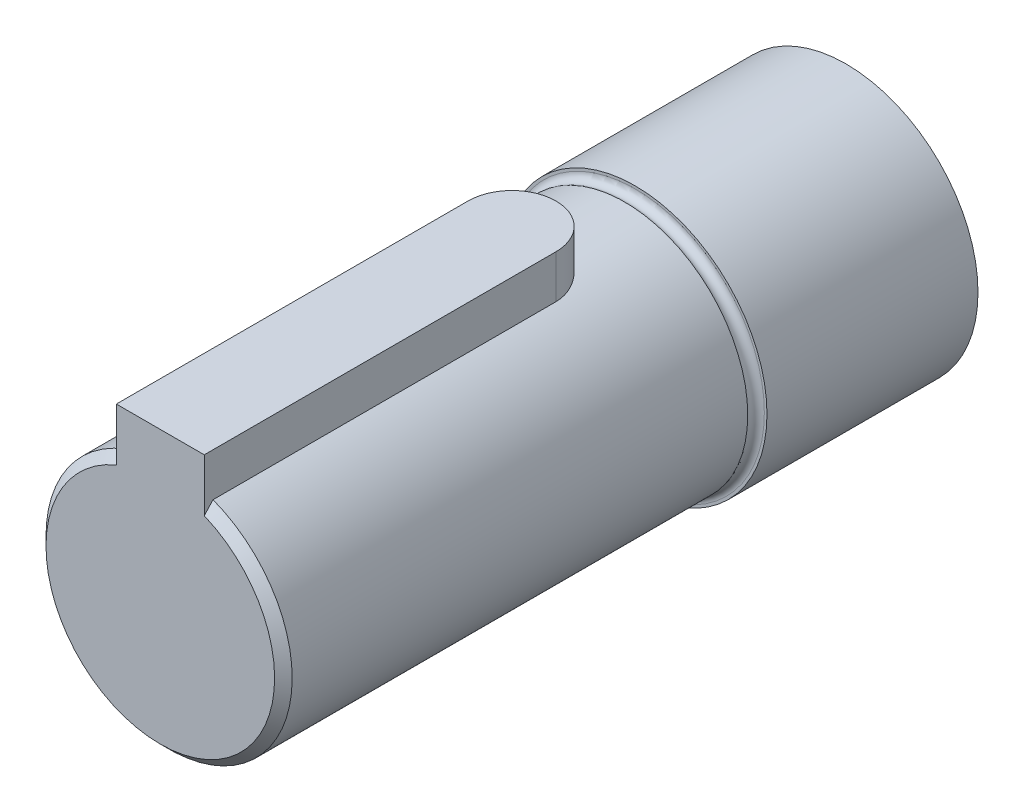
ISO-10303-21;
HEADER;
FILE_DESCRIPTION(('STEP AP214'),'2;1');
FILE_NAME('part.step','',(''),(''),'','','');
FILE_SCHEMA(('AUTOMOTIVE_DESIGN { 1 0 10303 214 1 1 1 1 }'));
ENDSEC;
DATA;
#1=APPLICATION_CONTEXT('core data for automotive mechanical design processes');
#2=APPLICATION_PROTOCOL_DEFINITION('international standard','automotive_design',2000,#1);
#3=PRODUCT_CONTEXT('',#1,'mechanical');
#4=PRODUCT('Part','Part','',(#3));
#5=PRODUCT_RELATED_PRODUCT_CATEGORY('part','',(#4));
#6=PRODUCT_DEFINITION_FORMATION('','',#4);
#7=PRODUCT_DEFINITION_CONTEXT('part definition',#1,'design');
#8=PRODUCT_DEFINITION('design','',#6,#7);
#9=PRODUCT_DEFINITION_SHAPE('','',#8);
#10=(LENGTH_UNIT() NAMED_UNIT(*) SI_UNIT(.MILLI.,.METRE.));
#11=(NAMED_UNIT(*) PLANE_ANGLE_UNIT() SI_UNIT($,.RADIAN.));
#12=(NAMED_UNIT(*) SI_UNIT($,.STERADIAN.) SOLID_ANGLE_UNIT());
#13=UNCERTAINTY_MEASURE_WITH_UNIT(LENGTH_MEASURE(1.E-05),#10,'distance_accuracy_value','');
#14=(GEOMETRIC_REPRESENTATION_CONTEXT(3) GLOBAL_UNCERTAINTY_ASSIGNED_CONTEXT((#13)) GLOBAL_UNIT_ASSIGNED_CONTEXT((#10,
#11,#12)) REPRESENTATION_CONTEXT('',''));
#15=CARTESIAN_POINT('',(0.,0.,0.));
#16=DIRECTION('',(0.,0.,1.));
#17=DIRECTION('',(1.,0.,0.));
#18=AXIS2_PLACEMENT_3D('',#15,#16,#17);
#19=CARTESIAN_POINT('',(0.,0.,29.4999999873967));
#20=DIRECTION('',(0.,0.,-1.));
#21=DIRECTION('',(-5.78142039967742E-10,-1.,0.));
#22=AXIS2_PLACEMENT_3D('',#19,#20,#21);
#23=CONICAL_SURFACE('',#22,7.0000000126033,0.785398163397454);
#24=CARTESIAN_POINT('',(-2.5,6.53834842880419,29.4999999873967));
#25=CARTESIAN_POINT('',(-2.5,6.3596151819461,29.6669457342591));
#26=CARTESIAN_POINT('',(-2.5,6.17964192467686,29.8341766803335));
#27=CARTESIAN_POINT('',(-2.5,5.99999998178189,30.0000000084084));
#28=B_SPLINE_CURVE_WITH_KNOTS('',3,(#24,#25,#26,#27),.UNSPECIFIED.,.F.,.F.,(4,4),(0.,1.),.UNSPECIFIED.);
#29=CARTESIAN_POINT('',(-2.5,6.53834842880419,29.4999999873967));
#30=VERTEX_POINT('',#29);
#31=CARTESIAN_POINT('',(-2.50000000646797,5.99999999730502,30.));
#32=VERTEX_POINT('',#31);
#33=EDGE_CURVE('E76',#30,#32,#28,.T.);
#34=ORIENTED_EDGE('',*,*,#33,.F.);
#35=CARTESIAN_POINT('',(0.,0.,29.4999999873967));
#36=DIRECTION('',(0.,0.,1.));
#37=DIRECTION('',(-0.357142856499832,0.934049773861726,0.));
#38=AXIS2_PLACEMENT_3D('',#35,#36,#37);
#39=CIRCLE('',#38,7.0000000126033);
#40=CARTESIAN_POINT('',(2.49999999999992,6.53834841531104,29.5));
#41=VERTEX_POINT('',#40);
#42=EDGE_CURVE('E64',#41,#30,#39,.F.);
#43=ORIENTED_EDGE('',*,*,#42,.F.);
#44=CARTESIAN_POINT('',(2.5,6.00000000000012,30.));
#45=CARTESIAN_POINT('',(2.5,6.17968129069737,29.83414034705));
#46=CARTESIAN_POINT('',(2.5,6.35965928277175,29.666904543798));
#47=CARTESIAN_POINT('',(2.5,6.53834841531104,29.5));
#48=B_SPLINE_CURVE_WITH_KNOTS('',3,(#44,#45,#46,#47),.UNSPECIFIED.,.F.,.F.,(4,4),(0.,1.),.UNSPECIFIED.);
#49=CARTESIAN_POINT('',(2.49999999999991,6.00000000000004,30.));
#50=VERTEX_POINT('',#49);
#51=EDGE_CURVE('E75',#50,#41,#48,.T.);
#52=ORIENTED_EDGE('',*,*,#51,.F.);
#53=CARTESIAN_POINT('',(0.,0.,30.));
#54=DIRECTION('',(0.,0.,-1.));
#55=DIRECTION('',(0.384615384615371,0.923076923076929,0.));
#56=AXIS2_PLACEMENT_3D('',#53,#54,#55);
#57=CIRCLE('',#56,6.5);
#58=EDGE_CURVE('E91',#50,#32,#57,.T.);
#59=ORIENTED_EDGE('',*,*,#58,.T.);
#60=EDGE_LOOP('',(#34,#43,#52,#59));
#61=FACE_BOUND('',#60,.T.);
#62=ADVANCED_FACE('F17',(#61),#23,.T.);
#63=CARTESIAN_POINT('',(6.67710892902475,-6.50000000066228,30.));
#64=DIRECTION('',(0.,0.,1.));
#65=DIRECTION('',(0.,1.,0.));
#66=AXIS2_PLACEMENT_3D('',#63,#64,#65);
#67=PLANE('',#66);
#68=ORIENTED_EDGE('',*,*,#58,.F.);
#69=DIRECTION('',(0.,1.,0.));
#70=VECTOR('',#69,1.);
#71=CARTESIAN_POINT('',(2.49999999999994,6.00000000000011,30.));
#72=LINE('',#71,#70);
#73=CARTESIAN_POINT('',(2.5,9.,30.));
#74=VERTEX_POINT('',#73);
#75=EDGE_CURVE('E119',#74,#50,#72,.F.);
#76=ORIENTED_EDGE('',*,*,#75,.F.);
#77=DIRECTION('',(-1.,0.,0.));
#78=VECTOR('',#77,1.);
#79=CARTESIAN_POINT('',(2.5,9.,30.));
#80=LINE('',#79,#78);
#81=CARTESIAN_POINT('',(-2.5,9.,30.));
#82=VERTEX_POINT('',#81);
#83=EDGE_CURVE('E123',#82,#74,#80,.F.);
#84=ORIENTED_EDGE('',*,*,#83,.F.);
#85=DIRECTION('',(0.,-1.,0.));
#86=VECTOR('',#85,1.);
#87=CARTESIAN_POINT('',(-2.5,9.,30.));
#88=LINE('',#87,#86);
#89=EDGE_CURVE('E127',#82,#32,#88,.T.);
#90=ORIENTED_EDGE('',*,*,#89,.T.);
#91=EDGE_LOOP('',(#68,#76,#84,#90));
#92=FACE_BOUND('',#91,.T.);
#93=ADVANCED_FACE('F105',(#92),#67,.T.);
#94=CARTESIAN_POINT('',(7.5,-7.70492968244106,3.));
#95=DIRECTION('',(0.,0.,1.));
#96=DIRECTION('',(0.,1.,0.));
#97=AXIS2_PLACEMENT_3D('',#94,#95,#96);
#98=PLANE('',#97);
#99=CARTESIAN_POINT('',(0.,0.,3.));
#100=DIRECTION('',(0.,0.,1.));
#101=DIRECTION('',(-1.,0.,0.));
#102=AXIS2_PLACEMENT_3D('',#99,#100,#101);
#103=CIRCLE('',#102,7.5);
#104=CARTESIAN_POINT('',(-7.5,0.,3.));
#105=VERTEX_POINT('',#104);
#106=EDGE_CURVE('E131',#105,#105,#103,.F.);
#107=ORIENTED_EDGE('',*,*,#106,.F.);
#108=EDGE_LOOP('',(#107));
#109=FACE_BOUND('',#108,.T.);
#110=CARTESIAN_POINT('',(0.,0.,3.));
#111=DIRECTION('',(0.,0.,-1.));
#112=DIRECTION('',(1.,-1.16855773734685E-09,0.));
#113=AXIS2_PLACEMENT_3D('',#110,#111,#112);
#114=CIRCLE('',#113,7.35);
#115=CARTESIAN_POINT('',(7.35,-8.58889936949936E-09,3.));
#116=VERTEX_POINT('',#115);
#117=EDGE_CURVE('E136',#116,#116,#114,.T.);
#118=ORIENTED_EDGE('',*,*,#117,.T.);
#119=EDGE_LOOP('',(#118));
#120=FACE_BOUND('',#119,.T.);
#121=ADVANCED_FACE('F229',(#109,#120),#98,.T.);
#122=CARTESIAN_POINT('',(-7.5,-7.70492968244106,-9.));
#123=DIRECTION('',(0.,0.,-1.));
#124=DIRECTION('',(0.,1.,0.));
#125=AXIS2_PLACEMENT_3D('',#122,#123,#124);
#126=PLANE('',#125);
#127=CARTESIAN_POINT('',(0.,0.,-9.));
#128=DIRECTION('',(0.,0.,-1.));
#129=DIRECTION('',(1.,0.,0.));
#130=AXIS2_PLACEMENT_3D('',#127,#128,#129);
#131=CIRCLE('',#130,7.5);
#132=CARTESIAN_POINT('',(7.5,0.,-9.));
#133=VERTEX_POINT('',#132);
#134=EDGE_CURVE('E139',#133,#133,#131,.T.);
#135=ORIENTED_EDGE('',*,*,#134,.T.);
#136=EDGE_LOOP('',(#135));
#137=FACE_BOUND('',#136,.T.);
#138=ADVANCED_FACE('F165',(#137),#126,.T.);
#139=CARTESIAN_POINT('',(0.,9.,10.));
#140=DIRECTION('',(0.,-1.,0.));
#141=DIRECTION('',(-1.,0.,0.));
#142=AXIS2_PLACEMENT_3D('',#139,#140,#141);
#143=CYLINDRICAL_SURFACE('',#142,2.5);
#144=DIRECTION('',(0.,-1.,0.));
#145=VECTOR('',#144,1.);
#146=CARTESIAN_POINT('',(2.5,9.,10.));
#147=LINE('',#146,#145);
#148=CARTESIAN_POINT('',(2.5,9.,10.));
#149=VERTEX_POINT('',#148);
#150=CARTESIAN_POINT('',(2.5,6.53834841531101,10.));
#151=VERTEX_POINT('',#150);
#152=EDGE_CURVE('E142',#149,#151,#147,.T.);
#153=ORIENTED_EDGE('',*,*,#152,.T.);
#154=CARTESIAN_POINT('',(2.5,6.53834841531101,10.));
#155=CARTESIAN_POINT('',(2.50000033042518,6.53834835698629,9.97131201048583));
#156=CARTESIAN_POINT('',(2.49950621211561,6.53854388529524,9.94262418556709));
#157=CARTESIAN_POINT('',(2.49753208366229,6.53931678359144,9.88530527254322));
#158=CARTESIAN_POINT('',(2.4960526800563,6.5398939186615,9.85667416039481));
#159=CARTESIAN_POINT('',(2.49211182631204,6.54142039381196,9.7995019639747));
#160=CARTESIAN_POINT('',(2.48965079776213,6.54236957410332,9.77096084634914));
#161=CARTESIAN_POINT('',(2.48375208937392,6.54463042552794,9.7140015605609));
#162=CARTESIAN_POINT('',(2.48031465935056,6.54594200393833,9.68558336283451));
#163=CARTESIAN_POINT('',(2.47246945648134,6.5489179656356,9.62890259502733));
#164=CARTESIAN_POINT('',(2.46806177558035,6.55058231549188,9.60064001045996));
#165=CARTESIAN_POINT('',(2.45828344785599,6.55425414698561,9.54430283383157));
#166=CARTESIAN_POINT('',(2.45291274919943,6.55626164709242,9.51622825197398));
#167=CARTESIAN_POINT('',(2.44121677033656,6.56061007245973,9.46029910743583));
#168=CARTESIAN_POINT('',(2.43489130870004,6.56295106108709,9.43244458763384));
#169=CARTESIAN_POINT('',(2.4212952043084,6.56795692200546,9.37698724927819));
#170=CARTESIAN_POINT('',(2.41402426464626,6.57062189601991,9.34938451271784));
#171=CARTESIAN_POINT('',(2.39854756331674,6.57626560037649,9.29446195584115));
#172=CARTESIAN_POINT('',(2.39034140317694,6.5792444644177,9.26714226157048));
#173=CARTESIAN_POINT('',(2.37301191436803,6.58550579889605,9.21283630033987));
#174=CARTESIAN_POINT('',(2.36388875706963,6.58878821259595,9.18584997213426));
#175=CARTESIAN_POINT('',(2.34477171500307,6.59561618136473,9.13233060563941));
#176=CARTESIAN_POINT('',(2.3347810273409,6.59916076365589,9.10579630077277));
#177=CARTESIAN_POINT('',(2.31395339151458,6.60649242392418,9.0532071448911));
#178=CARTESIAN_POINT('',(2.30311958539224,6.61027859289546,9.02715092243918));
#179=CARTESIAN_POINT('',(2.28062488013071,6.61807292191684,8.97552920274319));
#180=CARTESIAN_POINT('',(2.26896663515193,6.62208036123592,8.94996243979018));
#181=CARTESIAN_POINT('',(2.24484099774433,6.63029711374625,8.89933054655143));
#182=CARTESIAN_POINT('',(2.23237580495135,6.6345058706108,8.87426427763958));
#183=CARTESIAN_POINT('',(2.20665302576841,6.64310506670627,8.82464401542963));
#184=CARTESIAN_POINT('',(2.19339721585091,6.64749509227387,8.80008902934751));
#185=CARTESIAN_POINT('',(2.16610881128199,6.65643668218123,8.75150185416327));
#186=CARTESIAN_POINT('',(2.15207759916206,6.66098795413039,8.72746883463431));
#187=CARTESIAN_POINT('',(2.12325290447927,6.67023190759674,8.67993611678249));
#188=CARTESIAN_POINT('',(2.10846043754749,6.67492439740436,8.65643576518804));
#189=CARTESIAN_POINT('',(2.07812671008393,6.68443067975972,8.60997903294129));
#190=CARTESIAN_POINT('',(2.062586123146,6.68924436139204,8.58702218971792));
#191=CARTESIAN_POINT('',(2.03076865776043,6.698972939867,8.5416633660243));
#192=CARTESIAN_POINT('',(2.01449213361217,6.70388778739779,8.51926112642548));
#193=CARTESIAN_POINT('',(1.98121438944342,6.71379862931522,8.47502275563933));
#194=CARTESIAN_POINT('',(1.96421322515208,6.71879461744346,8.45318658112518));
#195=CARTESIAN_POINT('',(1.92949696360667,6.72884769068264,8.41009204679963));
#196=CARTESIAN_POINT('',(1.91178164235991,6.73390479460858,8.38883387183179));
#197=CARTESIAN_POINT('',(1.87564707604988,6.7440600670457,8.34690760541846));
#198=CARTESIAN_POINT('',(1.85722734442384,6.74915826194899,8.32623993972713));
#199=CARTESIAN_POINT('',(1.81969329728039,6.75937570269088,8.28550762051644));
#200=CARTESIAN_POINT('',(1.80057824829812,6.76449496539127,8.26544364710577));
#201=CARTESIAN_POINT('',(1.76166232578217,6.7747345398304,8.22593239270263));
#202=CARTESIAN_POINT('',(1.74186048630797,6.77985484206937,8.20648606062149));
#203=CARTESIAN_POINT('',(1.70157925982381,6.79007652988798,8.16822461059497));
#204=CARTESIAN_POINT('',(1.68109868786178,6.79517786299387,8.14941072609088));
#205=CARTESIAN_POINT('',(1.63946787843663,6.80534159035887,8.11242960869761));
#206=CARTESIAN_POINT('',(1.61831624978087,6.81040387244938,8.09426391100499));
#207=CARTESIAN_POINT('',(1.57535096763223,6.82046976538484,8.05859563019431));
#208=CARTESIAN_POINT('',(1.55353572925055,6.82547318844472,8.04109490305109));
#209=CARTESIAN_POINT('',(1.50925055820123,6.83540062338372,8.00677400545535));
#210=CARTESIAN_POINT('',(1.48677885901029,6.84032435225382,7.98995603234644));
#211=CARTESIAN_POINT('',(1.4411888543316,6.85007545470666,7.9570197783906));
#212=CARTESIAN_POINT('',(1.41806862220891,6.85490244692599,7.94090405107409));
#213=CARTESIAN_POINT('',(1.37142209661549,6.86438107311626,7.90954879761937));
#214=CARTESIAN_POINT('',(1.34789924957612,6.86903361541724,7.89430441949106));
#215=CARTESIAN_POINT('',(1.30067120207562,6.87810666463014,7.86481421880659));
#216=CARTESIAN_POINT('',(1.27697343132574,6.88252953962224,7.85055722642518));
#217=CARTESIAN_POINT('',(1.22941926862106,6.89114294154318,7.82301286257404));
#218=CARTESIAN_POINT('',(1.20556940745461,6.89533580901046,7.80971494819165));
#219=CARTESIAN_POINT('',(1.15773091271954,6.90348587947971,7.78406084967827));
#220=CARTESIAN_POINT('',(1.13374797989234,6.90744541491633,7.77169477659059));
#221=CARTESIAN_POINT('',(1.08566009690976,6.91512632113813,7.74787802348169));
#222=CARTESIAN_POINT('',(1.06156007673648,6.91884998223303,7.73641812862188));
#223=CARTESIAN_POINT('',(1.01325180679041,6.92605645545394,7.71438900483803));
#224=CARTESIAN_POINT('',(0.989047775156104,6.92954149382183,7.7038112547758));
#225=CARTESIAN_POINT('',(0.940542594725864,6.9362681168356,7.68352345513097));
#226=CARTESIAN_POINT('',(0.9162450089029,6.93951183784532,7.67380559603577));
#227=CARTESIAN_POINT('',(0.867561397392513,6.9457532324043,7.65521648011593));
#228=CARTESIAN_POINT('',(0.843178334856701,6.9487529270443,7.6463381423385));
#229=CARTESIAN_POINT('',(0.794330257617022,6.95450370456068,7.62940893710983));
#230=CARTESIAN_POINT('',(0.769867660486815,6.95725666762405,7.62135173336299));
#231=CARTESIAN_POINT('',(0.720865048376648,6.96251144222546,7.60604771480116));
#232=CARTESIAN_POINT('',(0.696326958930161,6.96501496777727,7.59879532380714));
#233=CARTESIAN_POINT('',(0.647176174448744,6.96976835292572,7.58508597359225));
#234=CARTESIAN_POINT('',(0.622564966079988,6.97201973578177,7.57862421324201));
#235=CARTESIAN_POINT('',(0.573269259916866,6.97626634524044,7.56648335514011));
#236=CARTESIAN_POINT('',(0.548585863056041,6.97826288086937,7.5608002457773));
#237=CARTESIAN_POINT('',(0.499145821531022,6.98199732852479,7.55020616362175));
#238=CARTESIAN_POINT('',(0.474389945456518,6.98373631337065,7.54529198275029));
#239=CARTESIAN_POINT('',(0.424803930445104,6.9869532133611,7.53622752221305));
#240=CARTESIAN_POINT('',(0.399974281651311,6.98843194504885,7.53207485152814));
#241=CARTESIAN_POINT('',(0.350238864488794,6.99112591181195,7.52452750736371));
#242=CARTESIAN_POINT('',(0.325333362433822,6.99234168936851,7.5211312728967));
#243=CARTESIAN_POINT('',(0.275443753480164,6.99450733770792,7.51509326304633));
#244=CARTESIAN_POINT('',(0.250459744569892,6.99545746175385,7.51245076902914));
#245=CARTESIAN_POINT('',(0.200410220199073,6.99708940689542,7.5079190966246));
#246=CARTESIAN_POINT('',(0.175344690915676,6.99777117980965,7.50603005351566));
#247=CARTESIAN_POINT('',(0.125129019775239,6.99886403745214,7.50300655748976));
#248=CARTESIAN_POINT('',(0.0999788098913837,6.99927476350071,7.50187310443445));
#249=CARTESIAN_POINT('',(0.0495906803332372,6.99982314985702,7.50036449910905));
#250=CARTESIAN_POINT('',(0.0243526971779215,6.99996013528159,7.49999122093946));
#251=CARTESIAN_POINT('',(-0.0262138522016395,6.99995866710894,7.50000912462505));
#252=CARTESIAN_POINT('',(-0.0515424174454474,6.99981922017041,7.50040306333379));
#253=CARTESIAN_POINT('',(-0.102292562202566,6.99926251479028,7.5019640156345));
#254=CARTESIAN_POINT('',(-0.12771401518503,6.99884394576933,7.5031346760854));
#255=CARTESIAN_POINT('',(-0.178651702410754,6.99772662106783,7.50626014325843));
#256=CARTESIAN_POINT('',(-0.204167622308781,6.99702624221045,7.50821949272161));
#257=CARTESIAN_POINT('',(-0.255295119076429,6.99534291665223,7.51293586009119));
#258=CARTESIAN_POINT('',(-0.280906130340833,6.99435804210822,7.51569832101481));
#259=CARTESIAN_POINT('',(-0.332223561327009,6.9921033346395,7.5220368710743));
#260=CARTESIAN_POINT('',(-0.357929099534993,6.99083128022607,7.52561930631113));
#261=CARTESIAN_POINT('',(-0.409433972067051,6.98799981053896,7.53361618081237));
#262=CARTESIAN_POINT('',(-0.43523204307352,6.98643789398421,7.53803787037782));
#263=CARTESIAN_POINT('',(-0.486918757688592,6.98302428136453,7.54773401420638));
#264=CARTESIAN_POINT('',(-0.512805688958429,6.981169820582,7.55301662228196));
#265=CARTESIAN_POINT('',(-0.564665034703364,6.97716868807356,7.56445770699753));
#266=CARTESIAN_POINT('',(-0.590635219181745,6.97501900677617,7.57062523834353));
#267=CARTESIAN_POINT('',(-0.642653849208492,6.97042496516034,7.58386156109214));
#268=CARTESIAN_POINT('',(-0.668699476868664,6.96797737053913,7.59094030337774));
#269=CARTESIAN_POINT('',(-0.72085937464593,6.96278507890305,7.6060266631998));
#270=CARTESIAN_POINT('',(-0.746970167132886,6.9600369454072,7.61404512086595));
#271=CARTESIAN_POINT('',(-0.79924805851622,6.95424088058603,7.63104064844712));
#272=CARTESIAN_POINT('',(-0.825410945749709,6.95118932996726,7.64002943807992));
#273=CARTESIAN_POINT('',(-0.877777822895495,6.94478466403061,7.65899745177019));
#274=CARTESIAN_POINT('',(-0.903976792687801,6.94142778363727,7.66898926363771));
#275=CARTESIAN_POINT('',(-0.956364489907798,6.93441138135515,7.68998385954125));
#276=CARTESIAN_POINT('',(-0.982547784185236,6.93074823747895,7.70099898940229));
#277=CARTESIAN_POINT('',(-1.03444339163169,6.92319715664518,7.72387843300328));
#278=CARTESIAN_POINT('',(-1.06015654923103,6.91930968864247,7.73574098672264));
#279=CARTESIAN_POINT('',(-1.11096400652725,6.91134689611999,7.76023463838376));
#280=CARTESIAN_POINT('',(-1.13606133339048,6.90727303587794,7.77285993428929));
#281=CARTESIAN_POINT('',(-1.185633199421,6.89895535111201,7.79885207508242));
#282=CARTESIAN_POINT('',(-1.21011067770648,6.89471276751009,7.81221371270706));
#283=CARTESIAN_POINT('',(-1.2584396252469,6.88607586017046,7.83965342037805));
#284=CARTESIAN_POINT('',(-1.2822939192903,6.88168256949183,7.85372684121363));
#285=CARTESIAN_POINT('',(-1.3293737492374,6.87276236118911,7.88256678859471));
#286=CARTESIAN_POINT('',(-1.35260197278715,6.86823628739327,7.89732918937071));
#287=CARTESIAN_POINT('',(-1.39842723805307,6.85906863225044,7.92752550786937));
#288=CARTESIAN_POINT('',(-1.42102680994452,6.85442772361998,7.94295579062739));
#289=CARTESIAN_POINT('',(-1.46559251413301,6.84504849310738,7.97446795259535));
#290=CARTESIAN_POINT('',(-1.48756100095085,6.84031069125652,7.99054665713922));
#291=CARTESIAN_POINT('',(-1.53086229760508,6.83075575169014,8.0233373382517));
#292=CARTESIAN_POINT('',(-1.55219726978297,6.82593899980414,8.04004657209347));
#293=CARTESIAN_POINT('',(-1.59422918095447,6.81624421838166,8.07408150529992));
#294=CARTESIAN_POINT('',(-1.61492807481116,6.81136645904778,8.0914048676523));
#295=CARTESIAN_POINT('',(-1.6556852230241,6.80156770230811,8.12665268665319));
#296=CARTESIAN_POINT('',(-1.67574521026723,6.79664687813169,8.14457518784997));
#297=CARTESIAN_POINT('',(-1.71522156454508,6.78678001244196,8.18100726147304));
#298=CARTESIAN_POINT('',(-1.73463942839255,6.78183406593576,8.19951523781869));
#299=CARTESIAN_POINT('',(-1.77282806330787,6.77193495744798,8.2371054955729));
#300=CARTESIAN_POINT('',(-1.79160008103715,6.76698183112709,8.25618651989974));
#301=CARTESIAN_POINT('',(-1.8284929482601,6.75708634588379,8.29491126910303));
#302=CARTESIAN_POINT('',(-1.84661477985318,6.75214398231484,8.31455405715657));
#303=CARTESIAN_POINT('',(-1.88220249160966,6.74228798632072,8.35439179184074));
#304=CARTESIAN_POINT('',(-1.89966907423854,6.73737432818914,8.37458610457773));
#305=CARTESIAN_POINT('',(-1.93394069819012,6.72759368749535,8.41551730627507));
#306=CARTESIAN_POINT('',(-1.95074614631177,6.72272667767027,8.43625384809619));
#307=CARTESIAN_POINT('',(-1.983689011437,6.71305725845671,8.47826077850066));
#308=CARTESIAN_POINT('',(-1.9998265223103,6.70825484005526,8.49953109139006));
#309=CARTESIAN_POINT('',(-2.03142603545337,6.69873250871243,8.54259757678868));
#310=CARTESIAN_POINT('',(-2.04688779993375,6.69401262515932,8.56439393028523));
#311=CARTESIAN_POINT('',(-2.07712727277772,6.68467324836683,8.60850513756579));
#312=CARTESIAN_POINT('',(-2.09190439129352,6.68005384344644,8.63082041444858));
#313=CARTESIAN_POINT('',(-2.1207648776146,6.670933288247,8.67596261840966));
#314=CARTESIAN_POINT('',(-2.13484728128047,6.66643230614545,8.69879019594274));
#315=CARTESIAN_POINT('',(-2.16230742444568,6.65756644001058,8.74495053756064));
#316=CARTESIAN_POINT('',(-2.17568380132375,6.65320182534268,8.76828416410872));
#317=CARTESIAN_POINT('',(-2.20171969210835,6.64462651623491,8.81545039935462));
#318=CARTESIAN_POINT('',(-2.21437741868644,6.64041621406247,8.83928406615386));
#319=CARTESIAN_POINT('',(-2.23896246360707,6.63216733046749,8.88744430490007));
#320=CARTESIAN_POINT('',(-2.25088754162491,6.62812928627256,8.91177211274221));
#321=CARTESIAN_POINT('',(-2.27399234211374,6.62024269729253,8.96091454726184));
#322=CARTESIAN_POINT('',(-2.28516934093589,6.6163948570311,8.98573056784214));
#323=CARTESIAN_POINT('',(-2.30676158381022,6.60890643218974,9.03584319034548));
#324=CARTESIAN_POINT('',(-2.31717358860567,6.60526674194719,9.06114132197275));
#325=CARTESIAN_POINT('',(-2.33721794844976,6.59821235201074,9.11221163071139));
#326=CARTESIAN_POINT('',(-2.34684651453894,6.59479875904948,9.13798544822012));
#327=CARTESIAN_POINT('',(-2.36530456868721,6.58821427296193,9.19000014127277));
#328=CARTESIAN_POINT('',(-2.37412968238799,6.5850447214315,9.21624273941674));
#329=CARTESIAN_POINT('',(-2.39095983964241,6.57896601778042,9.2691873968065));
#330=CARTESIAN_POINT('',(-2.39895988642059,6.57605846439706,9.29589122852343));
#331=CARTESIAN_POINT('',(-2.41411732971881,6.57052138814165,9.34974997757176));
#332=CARTESIAN_POINT('',(-2.42126906904711,6.56789374259328,9.37690668060049));
#333=CARTESIAN_POINT('',(-2.43470571653123,6.56293426781146,9.43166186113885));
#334=CARTESIAN_POINT('',(-2.44098426853711,6.56060461668582,9.45926209632233));
#335=CARTESIAN_POINT('',(-2.45264874234527,6.55625823286967,9.51489386074681));
#336=CARTESIAN_POINT('',(-2.45802757034528,6.55424399429345,9.54292707292447));
#337=CARTESIAN_POINT('',(-2.46785089968016,6.55055340148732,9.59933093736517));
#338=CARTESIAN_POINT('',(-2.47229035679781,6.54887887331518,9.62770258811842));
#339=CARTESIAN_POINT('',(-2.48019074918735,6.54589353088318,9.68459769916326));
#340=CARTESIAN_POINT('',(-2.48365179185423,6.54458267670518,9.71312114244302));
#341=CARTESIAN_POINT('',(-2.48958936713261,6.54232859304191,9.77028194064711));
#342=CARTESIAN_POINT('',(-2.49206599766069,6.54138532699391,9.79891928395581));
#343=CARTESIAN_POINT('',(-2.49603067390584,6.53987200270748,9.85627411069227));
#344=CARTESIAN_POINT('',(-2.49751865392874,6.53930196926977,9.88499159931825));
#345=CARTESIAN_POINT('',(-2.4995036020871,6.53854011962566,9.9424726851217));
#346=CARTESIAN_POINT('',(-2.50000033289154,6.53834839399617,9.97123629169161));
#347=CARTESIAN_POINT('',(-2.5,6.53834841531101,10.));
#348=B_SPLINE_CURVE_WITH_KNOTS('',3,(#154,#155,#156,#157,#158,#159,#160,#161,#162,#163,#164,
#165,#166,#167,#168,#169,#170,#171,#172,#173,#174,#175,#176,#177,#178,#179,#180,#181,#182,#183,
#184,#185,#186,#187,#188,#189,#190,#191,#192,#193,#194,#195,#196,#197,#198,#199,#200,#201,#202,
#203,#204,#205,#206,#207,#208,#209,#210,#211,#212,#213,#214,#215,#216,#217,#218,#219,#220,#221,
#222,#223,#224,#225,#226,#227,#228,#229,#230,#231,#232,#233,#234,#235,#236,#237,#238,#239,#240,
#241,#242,#243,#244,#245,#246,#247,#248,#249,#250,#251,#252,#253,#254,#255,#256,#257,#258,#259,
#260,#261,#262,#263,#264,#265,#266,#267,#268,#269,#270,#271,#272,#273,#274,#275,#276,#277,#278,
#279,#280,#281,#282,#283,#284,#285,#286,#287,#288,#289,#290,#291,#292,#293,#294,#295,#296,#297,
#298,#299,#300,#301,#302,#303,#304,#305,#306,#307,#308,#309,#310,#311,#312,#313,#314,#315,#316,
#317,#318,#319,#320,#321,#322,#323,#324,#325,#326,#327,#328,#329,#330,#331,#332,#333,#334,#335,
#336,#337,#338,#339,#340,#341,#342,#343,#344,#345,#346,#347),.UNSPECIFIED.,.F.,.F.,(4,2,2,2,2,2,
2,2,2,2,2,2,2,2,2,2,2,2,2,2,2,2,2,2,2,2,2,2,2,2,2,2,2,2,2,2,2,2,2,2,2,2,2,2,2,2,2,2,2,2,2,2,2,2,
2,2,2,2,2,2,2,2,2,2,2,2,2,2,2,2,2,2,2,2,2,2,2,2,2,2,2,2,2,2,2,2,2,2,2,2,2,2,2,2,2,2,4),(0.,
0.0860588023976493,0.172064676242217,0.258033651980493,0.343980652105276,0.429919511050653,
0.515862996934272,0.601822834961289,0.687809732308782,0.773833404315353,0.859841029789298,
0.9455441512117,1.03094191389155,1.11607627504036,1.20098761912048,1.2857148780205,
1.37029565963756,1.45476638387051,1.53916242501406,1.62351825954107,1.70786761826492,
1.79224364188557,1.87667903893765,1.96120624517687,2.04585758345945,2.13066542318788,
2.21566233841432,2.30088126370966,2.38635564692291,2.47211855892272,2.55734478488755,
2.64135109318956,2.72421592008262,2.80601821036486,2.88683743970778,2.96675363322279,
3.04584737965525,3.12419984063194,3.20189275444542,3.27900843393976,3.35562975816327,
3.43184015757662,3.50772359274345,3.58336452658266,3.6588478904201,3.73425904423751,
3.80968373166992,3.8852080304438,3.96091829906893,4.03690112069294,4.11324324509333,
4.19003152981495,4.26735288146066,4.34529419810951,4.42394231377301,4.50338394571057,
4.58370564531413,4.66499375314635,4.74733435858209,4.83081326436618,4.91551595626593,
5.00142198194096,5.08715450406958,5.17230151875668,5.25690885614809,5.3410211618551,
5.42468198792952,5.50793389234572,5.59081854636505,5.6733768490911,5.75564904846459,
5.83767486789305,5.91949363766403,6.0011444302488,6.08266619856755,6.16409791625537,
6.24547871894158,6.32684804553235,6.40824577846881,6.48971238192087,6.57128903687018,
6.65301777203694,6.73494158961437,6.81710458479343,6.89955205809087,6.98233061953599,
7.06548828382817,7.14907455564847,7.23314050439517,7.3177388277149,7.4029239033186,
7.48875182870155,7.57502954922615,7.66129779585493,7.7475574594858,7.83382285435283,
7.92010890093703),.UNSPECIFIED.);
#349=CARTESIAN_POINT('',(-2.5,6.53834841531101,10.));
#350=VERTEX_POINT('',#349);
#351=EDGE_CURVE('E145',#151,#350,#348,.T.);
#352=ORIENTED_EDGE('',*,*,#351,.T.);
#353=DIRECTION('',(0.,1.,0.));
#354=VECTOR('',#353,1.);
#355=CARTESIAN_POINT('',(-2.5,6.53834841531101,10.));
#356=LINE('',#355,#354);
#357=CARTESIAN_POINT('',(-2.5,9.,10.));
#358=VERTEX_POINT('',#357);
#359=EDGE_CURVE('E85',#358,#350,#356,.F.);
#360=ORIENTED_EDGE('',*,*,#359,.F.);
#361=CARTESIAN_POINT('',(0.,9.,10.));
#362=DIRECTION('',(0.,-1.,0.));
#363=DIRECTION('',(-1.,0.,0.));
#364=AXIS2_PLACEMENT_3D('',#361,#362,#363);
#365=CIRCLE('',#364,2.5);
#366=EDGE_CURVE('E39',#149,#358,#365,.F.);
#367=ORIENTED_EDGE('',*,*,#366,.F.);
#368=EDGE_LOOP('',(#153,#352,#360,#367));
#369=FACE_BOUND('',#368,.T.);
#370=ADVANCED_FACE('F155',(#369),#143,.T.);
#371=CARTESIAN_POINT('',(-2.5,5.99999976246169,30.0000002192661));
#372=DIRECTION('',(-1.,0.,0.));
#373=DIRECTION('',(0.,1.,0.));
#374=AXIS2_PLACEMENT_3D('',#371,#372,#373);
#375=PLANE('',#374);
#376=DIRECTION('',(0.,6.91957989929799E-10,1.));
#377=VECTOR('',#376,1.);
#378=CARTESIAN_POINT('',(-2.5,6.53834841531101,10.));
#379=LINE('',#378,#377);
#380=EDGE_CURVE('E67',#350,#30,#379,.T.);
#381=ORIENTED_EDGE('',*,*,#380,.T.);
#382=ORIENTED_EDGE('',*,*,#33,.T.);
#383=ORIENTED_EDGE('',*,*,#89,.F.);
#384=DIRECTION('',(0.,0.,-1.));
#385=VECTOR('',#384,1.);
#386=CARTESIAN_POINT('',(-2.5,9.,30.));
#387=LINE('',#386,#385);
#388=EDGE_CURVE('E86',#358,#82,#387,.F.);
#389=ORIENTED_EDGE('',*,*,#388,.F.);
#390=ORIENTED_EDGE('',*,*,#359,.T.);
#391=EDGE_LOOP('',(#381,#382,#383,#389,#390));
#392=FACE_BOUND('',#391,.T.);
#393=ADVANCED_FACE('F80',(#392),#375,.T.);
#394=CARTESIAN_POINT('',(2.5,6.,10.));
#395=DIRECTION('',(1.,0.,0.));
#396=DIRECTION('',(0.,1.,0.));
#397=AXIS2_PLACEMENT_3D('',#394,#395,#396);
#398=PLANE('',#397);
#399=ORIENTED_EDGE('',*,*,#75,.T.);
#400=ORIENTED_EDGE('',*,*,#51,.T.);
#401=DIRECTION('',(0.,0.,-1.));
#402=VECTOR('',#401,1.);
#403=CARTESIAN_POINT('',(2.5,6.53834841531104,29.5));
#404=LINE('',#403,#402);
#405=EDGE_CURVE('E70',#41,#151,#404,.T.);
#406=ORIENTED_EDGE('',*,*,#405,.T.);
#407=ORIENTED_EDGE('',*,*,#152,.F.);
#408=DIRECTION('',(0.,0.,1.));
#409=VECTOR('',#408,1.);
#410=CARTESIAN_POINT('',(2.5,9.,10.));
#411=LINE('',#410,#409);
#412=EDGE_CURVE('E28',#74,#149,#411,.F.);
#413=ORIENTED_EDGE('',*,*,#412,.F.);
#414=EDGE_LOOP('',(#399,#400,#406,#407,#413));
#415=FACE_BOUND('',#414,.T.);
#416=ADVANCED_FACE('F169',(#415),#398,.T.);
#417=CARTESIAN_POINT('',(-2.5,9.,7.25502455313909));
#418=DIRECTION('',(0.,1.,0.));
#419=DIRECTION('',(0.,0.,1.));
#420=AXIS2_PLACEMENT_3D('',#417,#418,#419);
#421=PLANE('',#420);
#422=ORIENTED_EDGE('',*,*,#366,.T.);
#423=ORIENTED_EDGE('',*,*,#388,.T.);
#424=ORIENTED_EDGE('',*,*,#83,.T.);
#425=ORIENTED_EDGE('',*,*,#412,.T.);
#426=EDGE_LOOP('',(#422,#423,#424,#425));
#427=FACE_BOUND('',#426,.T.);
#428=ADVANCED_FACE('F209',(#427),#421,.T.);
#429=CARTESIAN_POINT('',(0.,0.,-9.));
#430=DIRECTION('',(0.,0.,-1.));
#431=DIRECTION('',(1.,1.92336047429162E-10,0.));
#432=AXIS2_PLACEMENT_3D('',#429,#430,#431);
#433=CYLINDRICAL_SURFACE('',#432,7.);
#434=CARTESIAN_POINT('',(0.,0.,3.5936491673104));
#435=DIRECTION('',(0.,0.,1.));
#436=DIRECTION('',(-1.,0.,0.));
#437=AXIS2_PLACEMENT_3D('',#434,#435,#436);
#438=CIRCLE('',#437,7.);
#439=CARTESIAN_POINT('',(-7.,0.,3.5936491673104));
#440=VERTEX_POINT('',#439);
#441=EDGE_CURVE('E11',#440,#440,#438,.F.);
#442=ORIENTED_EDGE('',*,*,#441,.F.);
#443=EDGE_LOOP('',(#442));
#444=FACE_BOUND('',#443,.T.);
#445=ORIENTED_EDGE('',*,*,#42,.T.);
#446=ORIENTED_EDGE('',*,*,#380,.F.);
#447=ORIENTED_EDGE('',*,*,#351,.F.);
#448=ORIENTED_EDGE('',*,*,#405,.F.);
#449=EDGE_LOOP('',(#445,#446,#447,#448));
#450=FACE_BOUND('',#449,.T.);
#451=ADVANCED_FACE('F66',(#444,#450),#433,.T.);
#452=CARTESIAN_POINT('',(0.,0.,3.40000000000006));
#453=DIRECTION('',(0.,0.,-1.));
#454=DIRECTION('',(1.,0.,0.));
#455=AXIS2_PLACEMENT_3D('',#452,#453,#454);
#456=TOROIDAL_SURFACE('',#455,7.35000000000009,0.400000000000063);
#457=ORIENTED_EDGE('',*,*,#117,.F.);
#458=EDGE_LOOP('',(#457));
#459=FACE_BOUND('',#458,.T.);
#460=ORIENTED_EDGE('',*,*,#441,.T.);
#461=EDGE_LOOP('',(#460));
#462=FACE_BOUND('',#461,.T.);
#463=ADVANCED_FACE('F216',(#459,#462),#456,.F.);
#464=CARTESIAN_POINT('',(0.,0.,-9.));
#465=DIRECTION('',(0.,0.,-1.));
#466=DIRECTION('',(1.,0.,0.));
#467=AXIS2_PLACEMENT_3D('',#464,#465,#466);
#468=CYLINDRICAL_SURFACE('',#467,7.5);
#469=ORIENTED_EDGE('',*,*,#134,.F.);
#470=EDGE_LOOP('',(#469));
#471=FACE_BOUND('',#470,.T.);
#472=ORIENTED_EDGE('',*,*,#106,.T.);
#473=EDGE_LOOP('',(#472));
#474=FACE_BOUND('',#473,.T.);
#475=ADVANCED_FACE('F19',(#471,#474),#468,.T.);
#476=CLOSED_SHELL('',(#62,#93,#121,#138,#370,#393,#416,#428,#451,#463,#475));
#477=MANIFOLD_SOLID_BREP('B1',#476);
#478=ADVANCED_BREP_SHAPE_REPRESENTATION('',(#18,#477),#14);
#479=SHAPE_DEFINITION_REPRESENTATION(#9,#478);
ENDSEC;
END-ISO-10303-21;
